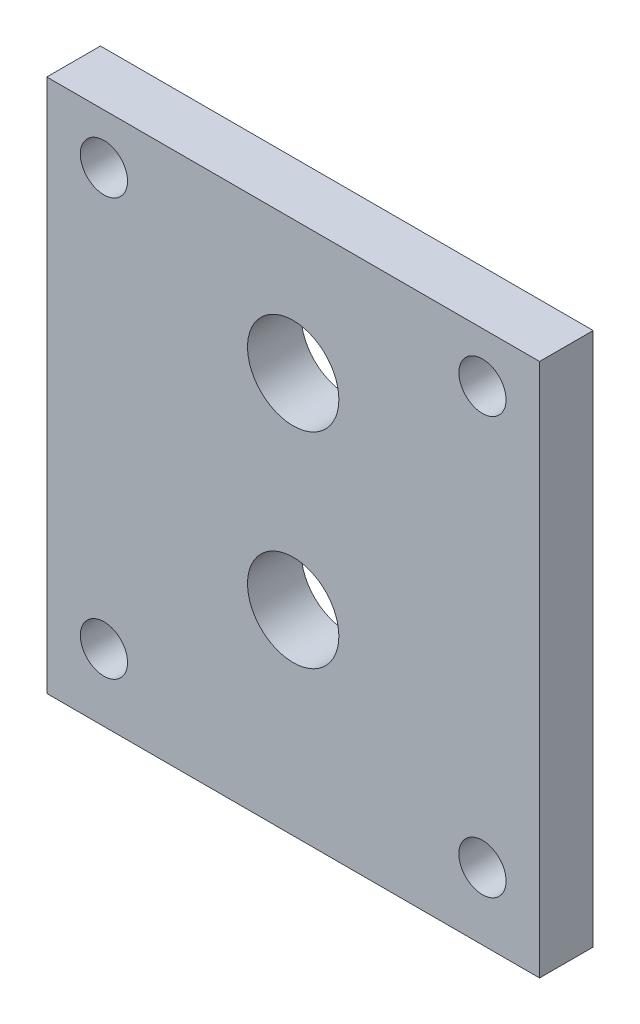
ISO-10303-21;
HEADER;
FILE_DESCRIPTION(('STEP AP214'),'2;1');
FILE_NAME('part.step','',(''),(''),'','','');
FILE_SCHEMA(('AUTOMOTIVE_DESIGN { 1 0 10303 214 1 1 1 1 }'));
ENDSEC;
DATA;
#1=APPLICATION_CONTEXT('core data for automotive mechanical design processes');
#2=APPLICATION_PROTOCOL_DEFINITION('international standard','automotive_design',2000,#1);
#3=PRODUCT_CONTEXT('',#1,'mechanical');
#4=PRODUCT('Part','Part','',(#3));
#5=PRODUCT_RELATED_PRODUCT_CATEGORY('part','',(#4));
#6=PRODUCT_DEFINITION_FORMATION('','',#4);
#7=PRODUCT_DEFINITION_CONTEXT('part definition',#1,'design');
#8=PRODUCT_DEFINITION('design','',#6,#7);
#9=PRODUCT_DEFINITION_SHAPE('','',#8);
#10=(LENGTH_UNIT() NAMED_UNIT(*) SI_UNIT(.MILLI.,.METRE.));
#11=(NAMED_UNIT(*) PLANE_ANGLE_UNIT() SI_UNIT($,.RADIAN.));
#12=(NAMED_UNIT(*) SI_UNIT($,.STERADIAN.) SOLID_ANGLE_UNIT());
#13=UNCERTAINTY_MEASURE_WITH_UNIT(LENGTH_MEASURE(1.E-05),#10,'distance_accuracy_value','');
#14=(GEOMETRIC_REPRESENTATION_CONTEXT(3) GLOBAL_UNCERTAINTY_ASSIGNED_CONTEXT((#13)) GLOBAL_UNIT_ASSIGNED_CONTEXT((#10,
#11,#12)) REPRESENTATION_CONTEXT('',''));
#15=CARTESIAN_POINT('',(0.,0.,0.));
#16=DIRECTION('',(0.,0.,1.));
#17=DIRECTION('',(1.,0.,0.));
#18=AXIS2_PLACEMENT_3D('',#15,#16,#17);
#19=CARTESIAN_POINT('',(0.,0.,3.175));
#20=DIRECTION('',(0.,0.,-1.));
#21=DIRECTION('',(-1.,0.,0.));
#22=AXIS2_PLACEMENT_3D('',#19,#20,#21);
#23=PLANE('',#22);
#24=CARTESIAN_POINT('',(25.6363977372346,-25.1066840960137,3.175));
#25=DIRECTION('',(0.,0.,1.));
#26=DIRECTION('',(1.,0.,0.));
#27=AXIS2_PLACEMENT_3D('',#24,#25,#26);
#28=CIRCLE('',#27,1.397);
#29=CARTESIAN_POINT('',(27.0333977372346,-25.1066840960137,3.175));
#30=VERTEX_POINT('',#29);
#31=EDGE_CURVE('E135',#30,#30,#28,.T.);
#32=ORIENTED_EDGE('',*,*,#31,.F.);
#33=EDGE_LOOP('',(#32));
#34=FACE_BOUND('',#33,.T.);
#35=CARTESIAN_POINT('',(25.6363977372346,-0.422913296013645,3.175));
#36=DIRECTION('',(0.,0.,1.));
#37=DIRECTION('',(1.,0.,0.));
#38=AXIS2_PLACEMENT_3D('',#35,#36,#37);
#39=CIRCLE('',#38,1.397);
#40=CARTESIAN_POINT('',(27.0333977372346,-0.422913296013645,3.175));
#41=VERTEX_POINT('',#40);
#42=EDGE_CURVE('E123',#41,#41,#39,.T.);
#43=ORIENTED_EDGE('',*,*,#42,.F.);
#44=EDGE_LOOP('',(#43));
#45=FACE_BOUND('',#44,.T.);
#46=CARTESIAN_POINT('',(14.4286316082346,-17.5014140640136,3.175));
#47=DIRECTION('',(0.,0.,1.));
#48=DIRECTION('',(1.,0.,0.));
#49=AXIS2_PLACEMENT_3D('',#46,#47,#48);
#50=CIRCLE('',#49,2.704093906);
#51=CARTESIAN_POINT('',(17.1327255142346,-17.5014140640136,3.175));
#52=VERTEX_POINT('',#51);
#53=EDGE_CURVE('E102',#52,#52,#50,.T.);
#54=ORIENTED_EDGE('',*,*,#53,.F.);
#55=EDGE_LOOP('',(#54));
#56=FACE_BOUND('',#55,.T.);
#57=DIRECTION('',(0.,-1.,0.));
#58=VECTOR('',#57,1.);
#59=CARTESIAN_POINT('',(-0.162758092130662,-29.0838313851706,3.175));
#60=LINE('',#59,#58);
#61=CARTESIAN_POINT('',(-0.162758092130662,2.53590869605556,3.175));
#62=VERTEX_POINT('',#61);
#63=CARTESIAN_POINT('',(-0.162758092130662,-29.0838313851706,3.175));
#64=VERTEX_POINT('',#63);
#65=EDGE_CURVE('E87',#62,#64,#60,.T.);
#66=ORIENTED_EDGE('',*,*,#65,.T.);
#67=DIRECTION('',(1.,0.,0.));
#68=VECTOR('',#67,1.);
#69=CARTESIAN_POINT('',(-0.162758092130662,-29.0838313851706,3.175));
#70=LINE('',#69,#68);
#71=CARTESIAN_POINT('',(29.0200213085998,-29.0838313851706,3.175));
#72=VERTEX_POINT('',#71);
#73=EDGE_CURVE('E82',#64,#72,#70,.T.);
#74=ORIENTED_EDGE('',*,*,#73,.T.);
#75=DIRECTION('',(0.,1.,0.));
#76=VECTOR('',#75,1.);
#77=CARTESIAN_POINT('',(29.0200213085998,-29.0838313851706,3.175));
#78=LINE('',#77,#76);
#79=CARTESIAN_POINT('',(29.0200213085998,2.53590869605556,3.175));
#80=VERTEX_POINT('',#79);
#81=EDGE_CURVE('E85',#72,#80,#78,.T.);
#82=ORIENTED_EDGE('',*,*,#81,.T.);
#83=DIRECTION('',(-1.,0.,0.));
#84=VECTOR('',#83,1.);
#85=CARTESIAN_POINT('',(-0.162758092130662,2.53590869605556,3.175));
#86=LINE('',#85,#84);
#87=EDGE_CURVE('E52',#80,#62,#86,.T.);
#88=ORIENTED_EDGE('',*,*,#87,.T.);
#89=EDGE_LOOP('',(#66,#74,#82,#88));
#90=FACE_BOUND('',#89,.T.);
#91=CARTESIAN_POINT('',(3.22086547923459,-0.422913296013645,3.175));
#92=DIRECTION('',(0.,0.,1.));
#93=DIRECTION('',(1.,0.,0.));
#94=AXIS2_PLACEMENT_3D('',#91,#92,#93);
#95=CIRCLE('',#94,1.397);
#96=CARTESIAN_POINT('',(4.61786547923459,-0.422913296013645,3.175));
#97=VERTEX_POINT('',#96);
#98=EDGE_CURVE('E117',#97,#97,#95,.T.);
#99=ORIENTED_EDGE('',*,*,#98,.F.);
#100=EDGE_LOOP('',(#99));
#101=FACE_BOUND('',#100,.T.);
#102=CARTESIAN_POINT('',(14.4286316082346,-5.35966737981364,3.175));
#103=DIRECTION('',(0.,0.,1.));
#104=DIRECTION('',(1.,0.,0.));
#105=AXIS2_PLACEMENT_3D('',#102,#103,#104);
#106=CIRCLE('',#105,2.704093906);
#107=CARTESIAN_POINT('',(17.1327255142346,-5.35966737981364,3.175));
#108=VERTEX_POINT('',#107);
#109=EDGE_CURVE('E129',#108,#108,#106,.T.);
#110=ORIENTED_EDGE('',*,*,#109,.F.);
#111=EDGE_LOOP('',(#110));
#112=FACE_BOUND('',#111,.T.);
#113=CARTESIAN_POINT('',(3.22086547923458,-25.1066840960137,3.175));
#114=DIRECTION('',(0.,0.,1.));
#115=DIRECTION('',(1.,0.,0.));
#116=AXIS2_PLACEMENT_3D('',#113,#114,#115);
#117=CIRCLE('',#116,1.397);
#118=CARTESIAN_POINT('',(4.61786547923458,-25.1066840960137,3.175));
#119=VERTEX_POINT('',#118);
#120=EDGE_CURVE('E141',#119,#119,#117,.T.);
#121=ORIENTED_EDGE('',*,*,#120,.F.);
#122=EDGE_LOOP('',(#121));
#123=FACE_BOUND('',#122,.T.);
#124=ADVANCED_FACE('F35',(#34,#45,#56,#90,#101,#112,#123),#23,.F.);
#125=CARTESIAN_POINT('',(0.,0.,0.));
#126=DIRECTION('',(0.,0.,-1.));
#127=DIRECTION('',(-1.,0.,0.));
#128=AXIS2_PLACEMENT_3D('',#125,#126,#127);
#129=PLANE('',#128);
#130=CARTESIAN_POINT('',(25.6363977372346,-25.1066840960137,0.));
#131=DIRECTION('',(0.,0.,1.));
#132=DIRECTION('',(1.,0.,0.));
#133=AXIS2_PLACEMENT_3D('',#130,#131,#132);
#134=CIRCLE('',#133,1.397);
#135=CARTESIAN_POINT('',(27.0333977372346,-25.1066840960137,0.));
#136=VERTEX_POINT('',#135);
#137=EDGE_CURVE('E138',#136,#136,#134,.T.);
#138=ORIENTED_EDGE('',*,*,#137,.T.);
#139=EDGE_LOOP('',(#138));
#140=FACE_BOUND('',#139,.T.);
#141=CARTESIAN_POINT('',(25.6363977372346,-0.422913296013645,0.));
#142=DIRECTION('',(0.,0.,1.));
#143=DIRECTION('',(1.,0.,0.));
#144=AXIS2_PLACEMENT_3D('',#141,#142,#143);
#145=CIRCLE('',#144,1.397);
#146=CARTESIAN_POINT('',(27.0333977372346,-0.422913296013645,0.));
#147=VERTEX_POINT('',#146);
#148=EDGE_CURVE('E126',#147,#147,#145,.T.);
#149=ORIENTED_EDGE('',*,*,#148,.T.);
#150=EDGE_LOOP('',(#149));
#151=FACE_BOUND('',#150,.T.);
#152=CARTESIAN_POINT('',(14.4286316082346,-17.5014140640136,0.));
#153=DIRECTION('',(0.,0.,1.));
#154=DIRECTION('',(1.,0.,0.));
#155=AXIS2_PLACEMENT_3D('',#152,#153,#154);
#156=CIRCLE('',#155,2.704093906);
#157=CARTESIAN_POINT('',(17.1327255142346,-17.5014140640136,0.));
#158=VERTEX_POINT('',#157);
#159=EDGE_CURVE('E114',#158,#158,#156,.T.);
#160=ORIENTED_EDGE('',*,*,#159,.T.);
#161=EDGE_LOOP('',(#160));
#162=FACE_BOUND('',#161,.T.);
#163=DIRECTION('',(0.,-1.,0.));
#164=VECTOR('',#163,1.);
#165=CARTESIAN_POINT('',(-0.162758092130662,-29.0838313851706,0.));
#166=LINE('',#165,#164);
#167=CARTESIAN_POINT('',(-0.162758092130662,2.53590869605556,0.));
#168=VERTEX_POINT('',#167);
#169=CARTESIAN_POINT('',(-0.162758092130662,-29.0838313851706,0.));
#170=VERTEX_POINT('',#169);
#171=EDGE_CURVE('E99',#168,#170,#166,.T.);
#172=ORIENTED_EDGE('',*,*,#171,.F.);
#173=DIRECTION('',(-1.,0.,0.));
#174=VECTOR('',#173,1.);
#175=CARTESIAN_POINT('',(-0.162758092130662,2.53590869605556,0.));
#176=LINE('',#175,#174);
#177=CARTESIAN_POINT('',(29.0200213085998,2.53590869605556,0.));
#178=VERTEX_POINT('',#177);
#179=EDGE_CURVE('E75',#178,#168,#176,.T.);
#180=ORIENTED_EDGE('',*,*,#179,.F.);
#181=DIRECTION('',(0.,1.,0.));
#182=VECTOR('',#181,1.);
#183=CARTESIAN_POINT('',(29.0200213085998,-29.0838313851706,0.));
#184=LINE('',#183,#182);
#185=CARTESIAN_POINT('',(29.0200213085998,-29.0838313851706,0.));
#186=VERTEX_POINT('',#185);
#187=EDGE_CURVE('E69',#186,#178,#184,.T.);
#188=ORIENTED_EDGE('',*,*,#187,.F.);
#189=DIRECTION('',(1.,0.,0.));
#190=VECTOR('',#189,1.);
#191=CARTESIAN_POINT('',(-0.162758092130662,-29.0838313851706,0.));
#192=LINE('',#191,#190);
#193=EDGE_CURVE('E91',#170,#186,#192,.T.);
#194=ORIENTED_EDGE('',*,*,#193,.F.);
#195=EDGE_LOOP('',(#172,#180,#188,#194));
#196=FACE_BOUND('',#195,.T.);
#197=CARTESIAN_POINT('',(3.22086547923459,-0.422913296013645,0.));
#198=DIRECTION('',(0.,0.,1.));
#199=DIRECTION('',(1.,0.,0.));
#200=AXIS2_PLACEMENT_3D('',#197,#198,#199);
#201=CIRCLE('',#200,1.397);
#202=CARTESIAN_POINT('',(4.61786547923459,-0.422913296013645,0.));
#203=VERTEX_POINT('',#202);
#204=EDGE_CURVE('E120',#203,#203,#201,.T.);
#205=ORIENTED_EDGE('',*,*,#204,.T.);
#206=EDGE_LOOP('',(#205));
#207=FACE_BOUND('',#206,.T.);
#208=CARTESIAN_POINT('',(14.4286316082346,-5.35966737981364,0.));
#209=DIRECTION('',(0.,0.,1.));
#210=DIRECTION('',(1.,0.,0.));
#211=AXIS2_PLACEMENT_3D('',#208,#209,#210);
#212=CIRCLE('',#211,2.704093906);
#213=CARTESIAN_POINT('',(17.1327255142346,-5.35966737981364,0.));
#214=VERTEX_POINT('',#213);
#215=EDGE_CURVE('E132',#214,#214,#212,.T.);
#216=ORIENTED_EDGE('',*,*,#215,.T.);
#217=EDGE_LOOP('',(#216));
#218=FACE_BOUND('',#217,.T.);
#219=CARTESIAN_POINT('',(3.22086547923458,-25.1066840960137,0.));
#220=DIRECTION('',(0.,0.,1.));
#221=DIRECTION('',(1.,0.,0.));
#222=AXIS2_PLACEMENT_3D('',#219,#220,#221);
#223=CIRCLE('',#222,1.397);
#224=CARTESIAN_POINT('',(4.61786547923458,-25.1066840960137,0.));
#225=VERTEX_POINT('',#224);
#226=EDGE_CURVE('E144',#225,#225,#223,.T.);
#227=ORIENTED_EDGE('',*,*,#226,.T.);
#228=EDGE_LOOP('',(#227));
#229=FACE_BOUND('',#228,.T.);
#230=ADVANCED_FACE('F110',(#140,#151,#162,#196,#207,#218,#229),#129,.T.);
#231=CARTESIAN_POINT('',(-0.162758092130662,-29.0838313851706,3.175));
#232=DIRECTION('',(1.,0.,0.));
#233=DIRECTION('',(0.,0.,-1.));
#234=AXIS2_PLACEMENT_3D('',#231,#232,#233);
#235=PLANE('',#234);
#236=ORIENTED_EDGE('',*,*,#171,.T.);
#237=DIRECTION('',(0.,0.,-1.));
#238=VECTOR('',#237,1.);
#239=CARTESIAN_POINT('',(-0.162758092130662,-29.0838313851706,3.175));
#240=LINE('',#239,#238);
#241=EDGE_CURVE('E11',#64,#170,#240,.T.);
#242=ORIENTED_EDGE('',*,*,#241,.F.);
#243=ORIENTED_EDGE('',*,*,#65,.F.);
#244=DIRECTION('',(0.,0.,-1.));
#245=VECTOR('',#244,1.);
#246=CARTESIAN_POINT('',(-0.162758092130662,2.53590869605556,3.175));
#247=LINE('',#246,#245);
#248=EDGE_CURVE('E95',#62,#168,#247,.T.);
#249=ORIENTED_EDGE('',*,*,#248,.T.);
#250=EDGE_LOOP('',(#236,#242,#243,#249));
#251=FACE_BOUND('',#250,.T.);
#252=ADVANCED_FACE('F37',(#251),#235,.F.);
#253=CARTESIAN_POINT('',(-0.162758092130662,-29.0838313851706,3.175));
#254=DIRECTION('',(0.,1.,0.));
#255=DIRECTION('',(-1.,0.,0.));
#256=AXIS2_PLACEMENT_3D('',#253,#254,#255);
#257=PLANE('',#256);
#258=ORIENTED_EDGE('',*,*,#193,.T.);
#259=DIRECTION('',(0.,0.,-1.));
#260=VECTOR('',#259,1.);
#261=CARTESIAN_POINT('',(29.0200213085998,-29.0838313851706,3.175));
#262=LINE('',#261,#260);
#263=EDGE_CURVE('E44',#72,#186,#262,.T.);
#264=ORIENTED_EDGE('',*,*,#263,.F.);
#265=ORIENTED_EDGE('',*,*,#73,.F.);
#266=ORIENTED_EDGE('',*,*,#241,.T.);
#267=EDGE_LOOP('',(#258,#264,#265,#266));
#268=FACE_BOUND('',#267,.T.);
#269=ADVANCED_FACE('F90',(#268),#257,.F.);
#270=CARTESIAN_POINT('',(29.0200213085998,-29.0838313851706,3.175));
#271=DIRECTION('',(-1.,0.,0.));
#272=DIRECTION('',(0.,-1.,0.));
#273=AXIS2_PLACEMENT_3D('',#270,#271,#272);
#274=PLANE('',#273);
#275=ORIENTED_EDGE('',*,*,#187,.T.);
#276=DIRECTION('',(0.,0.,-1.));
#277=VECTOR('',#276,1.);
#278=CARTESIAN_POINT('',(29.0200213085998,2.53590869605556,3.175));
#279=LINE('',#278,#277);
#280=EDGE_CURVE('E92',#80,#178,#279,.T.);
#281=ORIENTED_EDGE('',*,*,#280,.F.);
#282=ORIENTED_EDGE('',*,*,#81,.F.);
#283=ORIENTED_EDGE('',*,*,#263,.T.);
#284=EDGE_LOOP('',(#275,#281,#282,#283));
#285=FACE_BOUND('',#284,.T.);
#286=ADVANCED_FACE('F93',(#285),#274,.F.);
#287=CARTESIAN_POINT('',(-0.162758092130662,2.53590869605556,3.175));
#288=DIRECTION('',(0.,-1.,0.));
#289=DIRECTION('',(1.,0.,0.));
#290=AXIS2_PLACEMENT_3D('',#287,#288,#289);
#291=PLANE('',#290);
#292=ORIENTED_EDGE('',*,*,#179,.T.);
#293=ORIENTED_EDGE('',*,*,#248,.F.);
#294=ORIENTED_EDGE('',*,*,#87,.F.);
#295=ORIENTED_EDGE('',*,*,#280,.T.);
#296=EDGE_LOOP('',(#292,#293,#294,#295));
#297=FACE_BOUND('',#296,.T.);
#298=ADVANCED_FACE('F107',(#297),#291,.F.);
#299=CARTESIAN_POINT('',(14.4286316082346,-17.5014140640136,3.175));
#300=DIRECTION('',(0.,0.,-1.));
#301=DIRECTION('',(-1.,0.,0.));
#302=AXIS2_PLACEMENT_3D('',#299,#300,#301);
#303=CYLINDRICAL_SURFACE('',#302,2.704093906);
#304=ORIENTED_EDGE('',*,*,#53,.T.);
#305=EDGE_LOOP('',(#304));
#306=FACE_BOUND('',#305,.T.);
#307=ORIENTED_EDGE('',*,*,#159,.F.);
#308=EDGE_LOOP('',(#307));
#309=FACE_BOUND('',#308,.T.);
#310=ADVANCED_FACE('F164',(#306,#309),#303,.F.);
#311=CARTESIAN_POINT('',(3.22086547923459,-0.422913296013645,3.175));
#312=DIRECTION('',(0.,0.,-1.));
#313=DIRECTION('',(-1.,0.,0.));
#314=AXIS2_PLACEMENT_3D('',#311,#312,#313);
#315=CYLINDRICAL_SURFACE('',#314,1.397);
#316=ORIENTED_EDGE('',*,*,#98,.T.);
#317=EDGE_LOOP('',(#316));
#318=FACE_BOUND('',#317,.T.);
#319=ORIENTED_EDGE('',*,*,#204,.F.);
#320=EDGE_LOOP('',(#319));
#321=FACE_BOUND('',#320,.T.);
#322=ADVANCED_FACE('F210',(#318,#321),#315,.F.);
#323=CARTESIAN_POINT('',(25.6363977372346,-0.422913296013645,3.175));
#324=DIRECTION('',(0.,0.,-1.));
#325=DIRECTION('',(-1.,0.,0.));
#326=AXIS2_PLACEMENT_3D('',#323,#324,#325);
#327=CYLINDRICAL_SURFACE('',#326,1.397);
#328=ORIENTED_EDGE('',*,*,#42,.T.);
#329=EDGE_LOOP('',(#328));
#330=FACE_BOUND('',#329,.T.);
#331=ORIENTED_EDGE('',*,*,#148,.F.);
#332=EDGE_LOOP('',(#331));
#333=FACE_BOUND('',#332,.T.);
#334=ADVANCED_FACE('F218',(#330,#333),#327,.F.);
#335=CARTESIAN_POINT('',(14.4286316082346,-5.35966737981364,3.175));
#336=DIRECTION('',(0.,0.,-1.));
#337=DIRECTION('',(-1.,0.,0.));
#338=AXIS2_PLACEMENT_3D('',#335,#336,#337);
#339=CYLINDRICAL_SURFACE('',#338,2.704093906);
#340=ORIENTED_EDGE('',*,*,#109,.T.);
#341=EDGE_LOOP('',(#340));
#342=FACE_BOUND('',#341,.T.);
#343=ORIENTED_EDGE('',*,*,#215,.F.);
#344=EDGE_LOOP('',(#343));
#345=FACE_BOUND('',#344,.T.);
#346=ADVANCED_FACE('F226',(#342,#345),#339,.F.);
#347=CARTESIAN_POINT('',(25.6363977372346,-25.1066840960137,3.175));
#348=DIRECTION('',(0.,0.,-1.));
#349=DIRECTION('',(-1.,0.,0.));
#350=AXIS2_PLACEMENT_3D('',#347,#348,#349);
#351=CYLINDRICAL_SURFACE('',#350,1.397);
#352=ORIENTED_EDGE('',*,*,#31,.T.);
#353=EDGE_LOOP('',(#352));
#354=FACE_BOUND('',#353,.T.);
#355=ORIENTED_EDGE('',*,*,#137,.F.);
#356=EDGE_LOOP('',(#355));
#357=FACE_BOUND('',#356,.T.);
#358=ADVANCED_FACE('F235',(#354,#357),#351,.F.);
#359=CARTESIAN_POINT('',(3.22086547923458,-25.1066840960137,3.175));
#360=DIRECTION('',(0.,0.,-1.));
#361=DIRECTION('',(-1.,0.,0.));
#362=AXIS2_PLACEMENT_3D('',#359,#360,#361);
#363=CYLINDRICAL_SURFACE('',#362,1.397);
#364=ORIENTED_EDGE('',*,*,#120,.T.);
#365=EDGE_LOOP('',(#364));
#366=FACE_BOUND('',#365,.T.);
#367=ORIENTED_EDGE('',*,*,#226,.F.);
#368=EDGE_LOOP('',(#367));
#369=FACE_BOUND('',#368,.T.);
#370=ADVANCED_FACE('F150',(#366,#369),#363,.F.);
#371=CLOSED_SHELL('',(#124,#230,#252,#269,#286,#298,#310,#322,#334,#346,#358,#370));
#372=MANIFOLD_SOLID_BREP('B2',#371);
#373=ADVANCED_BREP_SHAPE_REPRESENTATION('',(#18,#372),#14);
#374=SHAPE_DEFINITION_REPRESENTATION(#9,#373);
ENDSEC;
END-ISO-10303-21;
